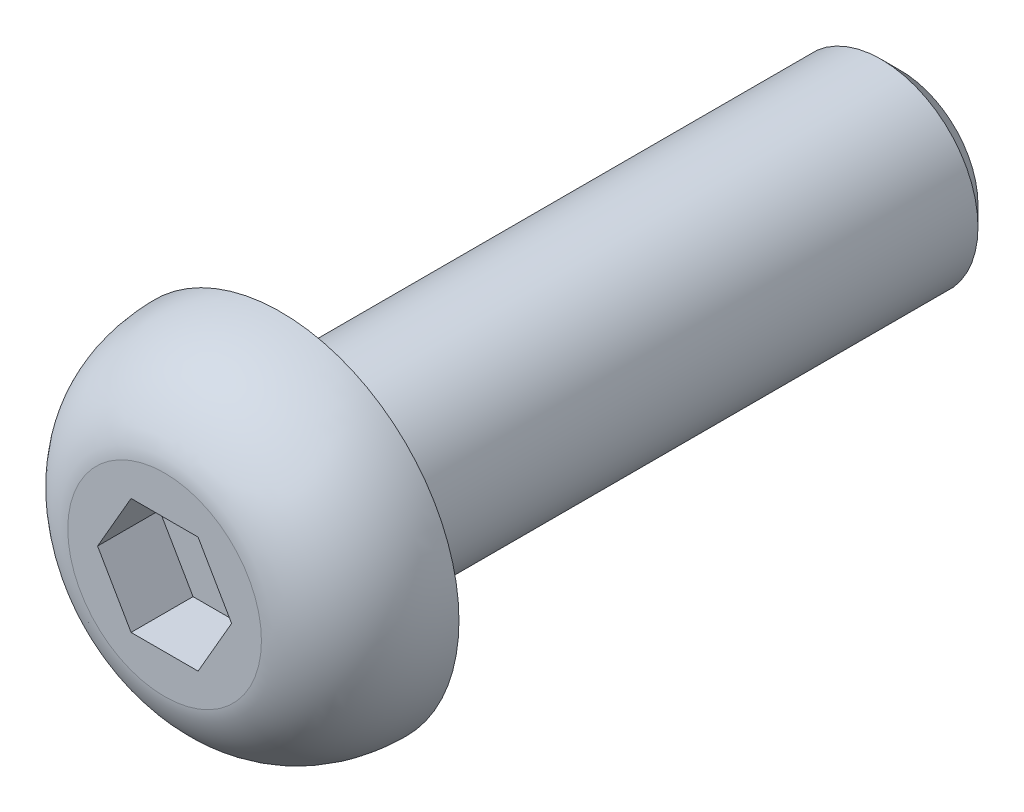
ISO-10303-21;
HEADER;
FILE_DESCRIPTION(('STEP AP214'),'2;1');
FILE_NAME('part.step','',(''),(''),'','','');
FILE_SCHEMA(('AUTOMOTIVE_DESIGN { 1 0 10303 214 1 1 1 1 }'));
ENDSEC;
DATA;
#1=APPLICATION_CONTEXT('core data for automotive mechanical design processes');
#2=APPLICATION_PROTOCOL_DEFINITION('international standard','automotive_design',2000,#1);
#3=PRODUCT_CONTEXT('',#1,'mechanical');
#4=PRODUCT('Part','Part','',(#3));
#5=PRODUCT_RELATED_PRODUCT_CATEGORY('part','',(#4));
#6=PRODUCT_DEFINITION_FORMATION('','',#4);
#7=PRODUCT_DEFINITION_CONTEXT('part definition',#1,'design');
#8=PRODUCT_DEFINITION('design','',#6,#7);
#9=PRODUCT_DEFINITION_SHAPE('','',#8);
#10=(LENGTH_UNIT() NAMED_UNIT(*) SI_UNIT(.MILLI.,.METRE.));
#11=(NAMED_UNIT(*) PLANE_ANGLE_UNIT() SI_UNIT($,.RADIAN.));
#12=(NAMED_UNIT(*) SI_UNIT($,.STERADIAN.) SOLID_ANGLE_UNIT());
#13=UNCERTAINTY_MEASURE_WITH_UNIT(LENGTH_MEASURE(1.E-05),#10,'distance_accuracy_value','');
#14=(GEOMETRIC_REPRESENTATION_CONTEXT(3) GLOBAL_UNCERTAINTY_ASSIGNED_CONTEXT((#13)) GLOBAL_UNIT_ASSIGNED_CONTEXT((#10,
#11,#12)) REPRESENTATION_CONTEXT('',''));
#15=CARTESIAN_POINT('',(0.,0.,0.));
#16=DIRECTION('',(0.,0.,1.));
#17=DIRECTION('',(1.,0.,0.));
#18=AXIS2_PLACEMENT_3D('',#15,#16,#17);
#19=CARTESIAN_POINT('',(0.,0.,0.7));
#20=DIRECTION('',(0.,0.,1.));
#21=DIRECTION('',(1.,0.,0.));
#22=AXIS2_PLACEMENT_3D('',#19,#20,#21);
#23=PLANE('',#22);
#24=DIRECTION('',(-0.50000000000019,0.866025403784329,0.));
#25=VECTOR('',#24,1.);
#26=CARTESIAN_POINT('',(0.865,0.,0.7));
#27=LINE('',#26,#25);
#28=CARTESIAN_POINT('',(0.865,0.,0.7));
#29=VERTEX_POINT('',#28);
#30=CARTESIAN_POINT('',(0.4325,0.749111974274,0.7));
#31=VERTEX_POINT('',#30);
#32=EDGE_CURVE('E11',#29,#31,#27,.T.);
#33=ORIENTED_EDGE('',*,*,#32,.T.);
#34=DIRECTION('',(-1.,0.,0.));
#35=VECTOR('',#34,1.);
#36=CARTESIAN_POINT('',(0.4325,0.749111974274,0.7));
#37=LINE('',#36,#35);
#38=CARTESIAN_POINT('',(-0.4325,0.749111974274,0.7));
#39=VERTEX_POINT('',#38);
#40=EDGE_CURVE('E27',#31,#39,#37,.T.);
#41=ORIENTED_EDGE('',*,*,#40,.T.);
#42=DIRECTION('',(-0.50000000000019,-0.866025403784329,0.));
#43=VECTOR('',#42,1.);
#44=CARTESIAN_POINT('',(-0.4325,0.749111974274,0.7));
#45=LINE('',#44,#43);
#46=CARTESIAN_POINT('',(-0.865,0.,0.7));
#47=VERTEX_POINT('',#46);
#48=EDGE_CURVE('E102',#39,#47,#45,.T.);
#49=ORIENTED_EDGE('',*,*,#48,.T.);
#50=DIRECTION('',(0.50000000000019,-0.866025403784329,0.));
#51=VECTOR('',#50,1.);
#52=CARTESIAN_POINT('',(-0.865,0.,0.7));
#53=LINE('',#52,#51);
#54=CARTESIAN_POINT('',(-0.4325,-0.749111974274,0.7));
#55=VERTEX_POINT('',#54);
#56=EDGE_CURVE('E99',#47,#55,#53,.T.);
#57=ORIENTED_EDGE('',*,*,#56,.T.);
#58=DIRECTION('',(1.,0.,0.));
#59=VECTOR('',#58,1.);
#60=CARTESIAN_POINT('',(-0.4325,-0.749111974274,0.7));
#61=LINE('',#60,#59);
#62=CARTESIAN_POINT('',(0.4325,-0.749111974274,0.7));
#63=VERTEX_POINT('',#62);
#64=EDGE_CURVE('E105',#55,#63,#61,.T.);
#65=ORIENTED_EDGE('',*,*,#64,.T.);
#66=DIRECTION('',(0.50000000000019,0.866025403784329,0.));
#67=VECTOR('',#66,1.);
#68=CARTESIAN_POINT('',(0.4325,-0.749111974274,0.7));
#69=LINE('',#68,#67);
#70=EDGE_CURVE('E130',#63,#29,#69,.T.);
#71=ORIENTED_EDGE('',*,*,#70,.T.);
#72=EDGE_LOOP('',(#33,#41,#49,#57,#65,#71));
#73=FACE_BOUND('',#72,.T.);
#74=ADVANCED_FACE('F17',(#73),#23,.T.);
#75=CARTESIAN_POINT('',(0.865,0.,0.7));
#76=DIRECTION('',(-0.866025403784329,-0.50000000000019,0.));
#77=DIRECTION('',(-0.50000000000019,0.866025403784329,0.));
#78=AXIS2_PLACEMENT_3D('',#75,#76,#77);
#79=PLANE('',#78);
#80=DIRECTION('',(0.,0.,1.));
#81=VECTOR('',#80,1.);
#82=CARTESIAN_POINT('',(0.865,0.,0.7));
#83=LINE('',#82,#81);
#84=CARTESIAN_POINT('',(0.865,0.,1.5));
#85=VERTEX_POINT('',#84);
#86=EDGE_CURVE('E129',#29,#85,#83,.T.);
#87=ORIENTED_EDGE('',*,*,#86,.T.);
#88=DIRECTION('',(-0.50000000000019,0.866025403784329,0.));
#89=VECTOR('',#88,1.);
#90=CARTESIAN_POINT('',(0.865,0.,1.5));
#91=LINE('',#90,#89);
#92=CARTESIAN_POINT('',(0.4325,0.749111974274,1.5));
#93=VERTEX_POINT('',#92);
#94=EDGE_CURVE('E314',#85,#93,#91,.T.);
#95=ORIENTED_EDGE('',*,*,#94,.T.);
#96=DIRECTION('',(0.,0.,1.));
#97=VECTOR('',#96,1.);
#98=CARTESIAN_POINT('',(0.4325,0.749111974274,0.7));
#99=LINE('',#98,#97);
#100=EDGE_CURVE('E139',#31,#93,#99,.T.);
#101=ORIENTED_EDGE('',*,*,#100,.F.);
#102=ORIENTED_EDGE('',*,*,#32,.F.);
#103=EDGE_LOOP('',(#87,#95,#101,#102));
#104=FACE_BOUND('',#103,.T.);
#105=ADVANCED_FACE('F19',(#104),#79,.T.);
#106=CARTESIAN_POINT('',(0.4325,0.749111974274,0.7));
#107=DIRECTION('',(0.,-1.,0.));
#108=DIRECTION('',(-1.,0.,0.));
#109=AXIS2_PLACEMENT_3D('',#106,#107,#108);
#110=PLANE('',#109);
#111=ORIENTED_EDGE('',*,*,#100,.T.);
#112=DIRECTION('',(-1.,0.,0.));
#113=VECTOR('',#112,1.);
#114=CARTESIAN_POINT('',(0.4325,0.749111974274,1.5));
#115=LINE('',#114,#113);
#116=CARTESIAN_POINT('',(-0.4325,0.749111974274,1.5));
#117=VERTEX_POINT('',#116);
#118=EDGE_CURVE('E309',#93,#117,#115,.T.);
#119=ORIENTED_EDGE('',*,*,#118,.T.);
#120=DIRECTION('',(0.,0.,1.));
#121=VECTOR('',#120,1.);
#122=CARTESIAN_POINT('',(-0.4325,0.749111974274,0.7));
#123=LINE('',#122,#121);
#124=EDGE_CURVE('E108',#39,#117,#123,.T.);
#125=ORIENTED_EDGE('',*,*,#124,.F.);
#126=ORIENTED_EDGE('',*,*,#40,.F.);
#127=EDGE_LOOP('',(#111,#119,#125,#126));
#128=FACE_BOUND('',#127,.T.);
#129=ADVANCED_FACE('F152',(#128),#110,.T.);
#130=CARTESIAN_POINT('',(-0.4325,0.749111974274,0.7));
#131=DIRECTION('',(0.866025403784329,-0.50000000000019,0.));
#132=DIRECTION('',(0.,0.,-1.));
#133=AXIS2_PLACEMENT_3D('',#130,#131,#132);
#134=PLANE('',#133);
#135=ORIENTED_EDGE('',*,*,#124,.T.);
#136=DIRECTION('',(-0.50000000000019,-0.866025403784329,0.));
#137=VECTOR('',#136,1.);
#138=CARTESIAN_POINT('',(-0.4325,0.749111974274,1.5));
#139=LINE('',#138,#137);
#140=CARTESIAN_POINT('',(-0.865,0.,1.5));
#141=VERTEX_POINT('',#140);
#142=EDGE_CURVE('E302',#117,#141,#139,.T.);
#143=ORIENTED_EDGE('',*,*,#142,.T.);
#144=DIRECTION('',(0.,0.,1.));
#145=VECTOR('',#144,1.);
#146=CARTESIAN_POINT('',(-0.865,0.,0.7));
#147=LINE('',#146,#145);
#148=EDGE_CURVE('E109',#47,#141,#147,.T.);
#149=ORIENTED_EDGE('',*,*,#148,.F.);
#150=ORIENTED_EDGE('',*,*,#48,.F.);
#151=EDGE_LOOP('',(#135,#143,#149,#150));
#152=FACE_BOUND('',#151,.T.);
#153=ADVANCED_FACE('F149',(#152),#134,.T.);
#154=CARTESIAN_POINT('',(-0.865,0.,0.7));
#155=DIRECTION('',(0.866025403784329,0.50000000000019,0.));
#156=DIRECTION('',(0.,0.,-1.));
#157=AXIS2_PLACEMENT_3D('',#154,#155,#156);
#158=PLANE('',#157);
#159=ORIENTED_EDGE('',*,*,#148,.T.);
#160=DIRECTION('',(0.50000000000019,-0.866025403784329,0.));
#161=VECTOR('',#160,1.);
#162=CARTESIAN_POINT('',(-0.865,0.,1.5));
#163=LINE('',#162,#161);
#164=CARTESIAN_POINT('',(-0.4325,-0.749111974274,1.5));
#165=VERTEX_POINT('',#164);
#166=EDGE_CURVE('E123',#141,#165,#163,.T.);
#167=ORIENTED_EDGE('',*,*,#166,.T.);
#168=DIRECTION('',(0.,0.,1.));
#169=VECTOR('',#168,1.);
#170=CARTESIAN_POINT('',(-0.4325,-0.749111974274,0.7));
#171=LINE('',#170,#169);
#172=EDGE_CURVE('E116',#55,#165,#171,.T.);
#173=ORIENTED_EDGE('',*,*,#172,.F.);
#174=ORIENTED_EDGE('',*,*,#56,.F.);
#175=EDGE_LOOP('',(#159,#167,#173,#174));
#176=FACE_BOUND('',#175,.T.);
#177=ADVANCED_FACE('F121',(#176),#158,.T.);
#178=CARTESIAN_POINT('',(-0.4325,-0.749111974274,0.7));
#179=DIRECTION('',(0.,1.,0.));
#180=DIRECTION('',(1.,0.,0.));
#181=AXIS2_PLACEMENT_3D('',#178,#179,#180);
#182=PLANE('',#181);
#183=ORIENTED_EDGE('',*,*,#172,.T.);
#184=DIRECTION('',(1.,0.,0.));
#185=VECTOR('',#184,1.);
#186=CARTESIAN_POINT('',(-0.4325,-0.749111974274,1.5));
#187=LINE('',#186,#185);
#188=CARTESIAN_POINT('',(0.4325,-0.749111974274,1.5));
#189=VERTEX_POINT('',#188);
#190=EDGE_CURVE('E298',#165,#189,#187,.T.);
#191=ORIENTED_EDGE('',*,*,#190,.T.);
#192=DIRECTION('',(0.,0.,1.));
#193=VECTOR('',#192,1.);
#194=CARTESIAN_POINT('',(0.4325,-0.749111974274,0.7));
#195=LINE('',#194,#193);
#196=EDGE_CURVE('E119',#63,#189,#195,.T.);
#197=ORIENTED_EDGE('',*,*,#196,.F.);
#198=ORIENTED_EDGE('',*,*,#64,.F.);
#199=EDGE_LOOP('',(#183,#191,#197,#198));
#200=FACE_BOUND('',#199,.T.);
#201=ADVANCED_FACE('F111',(#200),#182,.T.);
#202=CARTESIAN_POINT('',(0.4325,-0.749111974274,0.7));
#203=DIRECTION('',(-0.866025403784329,0.50000000000019,0.));
#204=DIRECTION('',(0.,0.,1.));
#205=AXIS2_PLACEMENT_3D('',#202,#203,#204);
#206=PLANE('',#205);
#207=ORIENTED_EDGE('',*,*,#196,.T.);
#208=DIRECTION('',(0.50000000000019,0.866025403784329,0.));
#209=VECTOR('',#208,1.);
#210=CARTESIAN_POINT('',(0.4325,-0.749111974274,1.5));
#211=LINE('',#210,#209);
#212=EDGE_CURVE('E288',#189,#85,#211,.T.);
#213=ORIENTED_EDGE('',*,*,#212,.T.);
#214=ORIENTED_EDGE('',*,*,#86,.F.);
#215=ORIENTED_EDGE('',*,*,#70,.F.);
#216=EDGE_LOOP('',(#207,#213,#214,#215));
#217=FACE_BOUND('',#216,.T.);
#218=ADVANCED_FACE('F169',(#217),#206,.T.);
#219=CARTESIAN_POINT('',(0.,0.,1.5));
#220=DIRECTION('',(0.,0.,1.));
#221=DIRECTION('',(1.,0.,0.));
#222=AXIS2_PLACEMENT_3D('',#219,#220,#221);
#223=PLANE('',#222);
#224=ORIENTED_EDGE('',*,*,#190,.F.);
#225=ORIENTED_EDGE('',*,*,#166,.F.);
#226=ORIENTED_EDGE('',*,*,#142,.F.);
#227=ORIENTED_EDGE('',*,*,#118,.F.);
#228=ORIENTED_EDGE('',*,*,#94,.F.);
#229=ORIENTED_EDGE('',*,*,#212,.F.);
#230=EDGE_LOOP('',(#224,#225,#226,#227,#228,#229));
#231=FACE_BOUND('',#230,.T.);
#232=CARTESIAN_POINT('',(0.,0.,1.5));
#233=DIRECTION('',(0.,0.,1.));
#234=DIRECTION('',(1.,0.,0.));
#235=AXIS2_PLACEMENT_3D('',#232,#233,#234);
#236=CIRCLE('',#235,1.25);
#237=CARTESIAN_POINT('',(1.25,0.,1.5));
#238=VERTEX_POINT('',#237);
#239=EDGE_CURVE('E293',#238,#238,#236,.T.);
#240=ORIENTED_EDGE('',*,*,#239,.T.);
#241=EDGE_LOOP('',(#240));
#242=FACE_BOUND('',#241,.T.);
#243=ADVANCED_FACE('F165',(#231,#242),#223,.T.);
#244=CARTESIAN_POINT('',(1.25,0.,1.5));
#245=CARTESIAN_POINT('',(1.551492,0.,1.474631));
#246=CARTESIAN_POINT('',(2.292234,0.,1.088458));
#247=CARTESIAN_POINT('',(2.3,0.,0.));
#248=(BOUNDED_CURVE() B_SPLINE_CURVE(3,(#244,#245,#246,#247),.UNSPECIFIED.,.F.,
.F.) B_SPLINE_CURVE_WITH_KNOTS((4,4),(0.,1.),
.UNSPECIFIED.) CURVE() GEOMETRIC_REPRESENTATION_ITEM() RATIONAL_B_SPLINE_CURVE((1.,1.,1.,1.)) REPRESENTATION_ITEM(''));
#249=CARTESIAN_POINT('',(0.,0.,0.));
#250=DIRECTION('',(0.,0.,-1.));
#251=AXIS1_PLACEMENT('',#249,#250);
#252=SURFACE_OF_REVOLUTION('',#248,#251);
#253=CARTESIAN_POINT('',(1.25,0.,1.5));
#254=CARTESIAN_POINT('',(1.551492,0.,1.474631));
#255=CARTESIAN_POINT('',(2.292234,0.,1.088458));
#256=CARTESIAN_POINT('',(2.3,0.,0.));
#257=(BOUNDED_CURVE() B_SPLINE_CURVE(3,(#253,#254,#255,#256),.UNSPECIFIED.,.F.,
.F.) B_SPLINE_CURVE_WITH_KNOTS((4,4),(0.,1.),
.UNSPECIFIED.) CURVE() GEOMETRIC_REPRESENTATION_ITEM() RATIONAL_B_SPLINE_CURVE((1.,1.,1.,1.)) REPRESENTATION_ITEM(''));
#258=CARTESIAN_POINT('',(2.3,0.,0.));
#259=VERTEX_POINT('',#258);
#260=EDGE_CURVE('E285',#238,#259,#257,.T.);
#261=ORIENTED_EDGE('',*,*,#260,.T.);
#262=CARTESIAN_POINT('',(0.,0.,0.));
#263=DIRECTION('',(0.,0.,1.));
#264=DIRECTION('',(1.,0.,0.));
#265=AXIS2_PLACEMENT_3D('',#262,#263,#264);
#266=CIRCLE('',#265,2.3);
#267=EDGE_CURVE('E281',#259,#259,#266,.T.);
#268=ORIENTED_EDGE('',*,*,#267,.T.);
#269=ORIENTED_EDGE('',*,*,#260,.F.);
#270=ORIENTED_EDGE('',*,*,#239,.F.);
#271=EDGE_LOOP('',(#261,#268,#269,#270));
#272=FACE_BOUND('',#271,.T.);
#273=ADVANCED_FACE('F170',(#272),#252,.T.);
#274=CARTESIAN_POINT('',(0.,0.,0.));
#275=DIRECTION('',(0.,0.,1.));
#276=DIRECTION('',(1.,0.,0.));
#277=AXIS2_PLACEMENT_3D('',#274,#275,#276);
#278=PLANE('',#277);
#279=ORIENTED_EDGE('',*,*,#267,.F.);
#280=EDGE_LOOP('',(#279));
#281=FACE_BOUND('',#280,.T.);
#282=CARTESIAN_POINT('',(0.,0.,0.));
#283=DIRECTION('',(0.,0.,1.));
#284=DIRECTION('',(1.,0.,0.));
#285=AXIS2_PLACEMENT_3D('',#282,#283,#284);
#286=CIRCLE('',#285,1.25);
#287=CARTESIAN_POINT('',(1.25,0.,0.));
#288=VERTEX_POINT('',#287);
#289=EDGE_CURVE('E278',#288,#288,#286,.T.);
#290=ORIENTED_EDGE('',*,*,#289,.T.);
#291=EDGE_LOOP('',(#290));
#292=FACE_BOUND('',#291,.T.);
#293=ADVANCED_FACE('F202',(#281,#292),#278,.F.);
#294=CARTESIAN_POINT('',(0.,0.,-7.75));
#295=DIRECTION('',(0.,0.,1.));
#296=DIRECTION('',(1.,0.,0.));
#297=AXIS2_PLACEMENT_3D('',#294,#295,#296);
#298=CYLINDRICAL_SURFACE('',#297,1.25);
#299=CARTESIAN_POINT('',(0.,0.,-7.75));
#300=DIRECTION('',(0.,0.,1.));
#301=DIRECTION('',(1.,0.,0.));
#302=AXIS2_PLACEMENT_3D('',#299,#300,#301);
#303=CIRCLE('',#302,1.25);
#304=CARTESIAN_POINT('',(1.25,0.,-7.75));
#305=VERTEX_POINT('',#304);
#306=EDGE_CURVE('E266',#305,#305,#303,.T.);
#307=ORIENTED_EDGE('',*,*,#306,.T.);
#308=DIRECTION('',(0.,0.,1.));
#309=VECTOR('',#308,1.);
#310=CARTESIAN_POINT('',(1.25,0.,-7.75));
#311=LINE('',#310,#309);
#312=EDGE_CURVE('E275',#305,#288,#311,.T.);
#313=ORIENTED_EDGE('',*,*,#312,.T.);
#314=ORIENTED_EDGE('',*,*,#289,.F.);
#315=ORIENTED_EDGE('',*,*,#312,.F.);
#316=EDGE_LOOP('',(#307,#313,#314,#315));
#317=FACE_BOUND('',#316,.T.);
#318=ADVANCED_FACE('F188',(#317),#298,.T.);
#319=CARTESIAN_POINT('',(0.,0.,-8.));
#320=DIRECTION('',(0.,0.,1.));
#321=DIRECTION('',(1.,0.,0.));
#322=AXIS2_PLACEMENT_3D('',#319,#320,#321);
#323=CONICAL_SURFACE('',#322,1.,0.785398163397);
#324=CARTESIAN_POINT('',(0.,0.,-8.));
#325=DIRECTION('',(0.,0.,1.));
#326=DIRECTION('',(1.,0.,0.));
#327=AXIS2_PLACEMENT_3D('',#324,#325,#326);
#328=CIRCLE('',#327,1.);
#329=CARTESIAN_POINT('',(1.,0.,-8.));
#330=VERTEX_POINT('',#329);
#331=EDGE_CURVE('E262',#330,#330,#328,.T.);
#332=ORIENTED_EDGE('',*,*,#331,.T.);
#333=DIRECTION('',(0.707106781186548,0.,0.707106781186548));
#334=VECTOR('',#333,1.);
#335=CARTESIAN_POINT('',(1.,0.,-8.));
#336=LINE('',#335,#334);
#337=EDGE_CURVE('E265',#330,#305,#336,.T.);
#338=ORIENTED_EDGE('',*,*,#337,.T.);
#339=ORIENTED_EDGE('',*,*,#306,.F.);
#340=ORIENTED_EDGE('',*,*,#337,.F.);
#341=EDGE_LOOP('',(#332,#338,#339,#340));
#342=FACE_BOUND('',#341,.T.);
#343=ADVANCED_FACE('F179',(#342),#323,.T.);
#344=CARTESIAN_POINT('',(0.,0.,-8.));
#345=DIRECTION('',(0.,0.,1.));
#346=DIRECTION('',(1.,0.,0.));
#347=AXIS2_PLACEMENT_3D('',#344,#345,#346);
#348=PLANE('',#347);
#349=ORIENTED_EDGE('',*,*,#331,.F.);
#350=EDGE_LOOP('',(#349));
#351=FACE_BOUND('',#350,.T.);
#352=ADVANCED_FACE('F175',(#351),#348,.F.);
#353=CLOSED_SHELL('',(#74,#105,#129,#153,#177,#201,#218,#243,#273,#293,#318,#343,#352));
#354=MANIFOLD_SOLID_BREP('B1',#353);
#355=ADVANCED_BREP_SHAPE_REPRESENTATION('',(#18,#354),#14);
#356=SHAPE_DEFINITION_REPRESENTATION(#9,#355);
ENDSEC;
END-ISO-10303-21;
